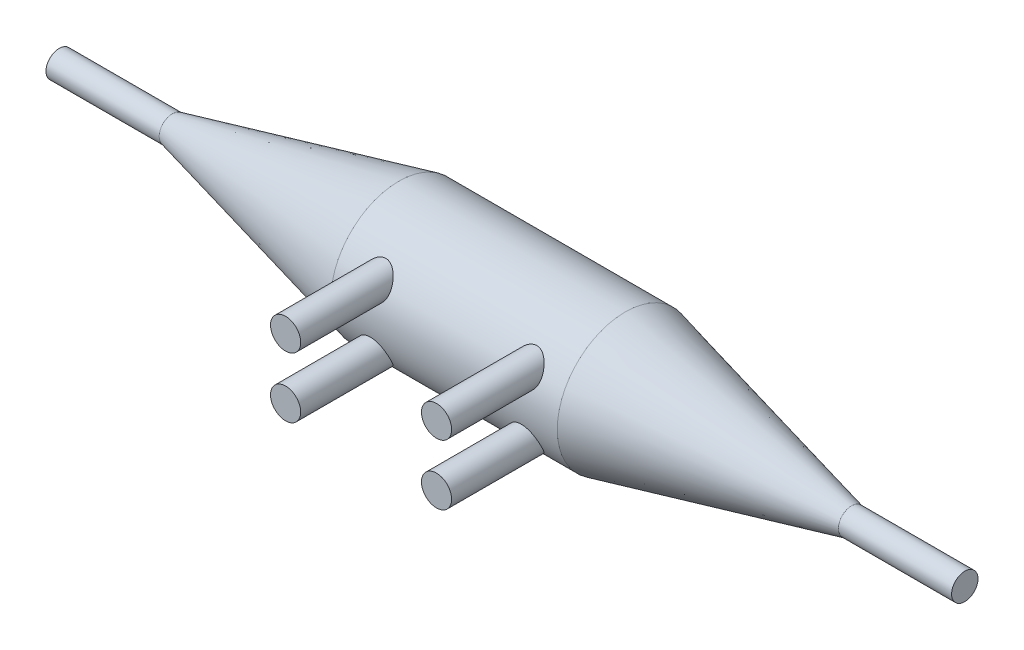
ISO-10303-21;
HEADER;
FILE_DESCRIPTION(('STEP AP214'),'2;1');
FILE_NAME('part.step','',(''),(''),'','','');
FILE_SCHEMA(('AUTOMOTIVE_DESIGN { 1 0 10303 214 1 1 1 1 }'));
ENDSEC;
DATA;
#1=APPLICATION_CONTEXT('core data for automotive mechanical design processes');
#2=APPLICATION_PROTOCOL_DEFINITION('international standard','automotive_design',2000,#1);
#3=PRODUCT_CONTEXT('',#1,'mechanical');
#4=PRODUCT('Part','Part','',(#3));
#5=PRODUCT_RELATED_PRODUCT_CATEGORY('part','',(#4));
#6=PRODUCT_DEFINITION_FORMATION('','',#4);
#7=PRODUCT_DEFINITION_CONTEXT('part definition',#1,'design');
#8=PRODUCT_DEFINITION('design','',#6,#7);
#9=PRODUCT_DEFINITION_SHAPE('','',#8);
#10=(LENGTH_UNIT() NAMED_UNIT(*) SI_UNIT(.MILLI.,.METRE.));
#11=(NAMED_UNIT(*) PLANE_ANGLE_UNIT() SI_UNIT($,.RADIAN.));
#12=(NAMED_UNIT(*) SI_UNIT($,.STERADIAN.) SOLID_ANGLE_UNIT());
#13=UNCERTAINTY_MEASURE_WITH_UNIT(LENGTH_MEASURE(1.E-05),#10,'distance_accuracy_value','');
#14=(GEOMETRIC_REPRESENTATION_CONTEXT(3) GLOBAL_UNCERTAINTY_ASSIGNED_CONTEXT((#13)) GLOBAL_UNIT_ASSIGNED_CONTEXT((#10,
#11,#12)) REPRESENTATION_CONTEXT('',''));
#15=CARTESIAN_POINT('',(0.,0.,0.));
#16=DIRECTION('',(0.,0.,1.));
#17=DIRECTION('',(1.,0.,0.));
#18=AXIS2_PLACEMENT_3D('',#15,#16,#17);
#19=CARTESIAN_POINT('',(103.259169382463,0.,0.));
#20=DIRECTION('',(1.,0.,0.));
#21=DIRECTION('',(0.,1.,0.));
#22=AXIS2_PLACEMENT_3D('',#19,#20,#21);
#23=CYLINDRICAL_SURFACE('',#22,9.);
#24=CARTESIAN_POINT('',(51.2591693824631,4.,8.06225774829855));
#25=CARTESIAN_POINT('',(51.2591714976189,4.12894286634209,7.99828035942443));
#26=CARTESIAN_POINT('',(51.2716561331024,4.25636317802113,7.93117108595877));
#27=CARTESIAN_POINT('',(51.3197199877549,4.50453397744185,7.79290857464164));
#28=CARTESIAN_POINT('',(51.3553252244888,4.62527678469449,7.72175086349652));
#29=CARTESIAN_POINT('',(51.4477930596246,4.85699742894244,7.57813396711227));
#30=CARTESIAN_POINT('',(51.5046033625781,4.9679984658663,7.50567839770059));
#31=CARTESIAN_POINT('',(51.6382866022753,5.17824136437868,7.36220031286894));
#32=CARTESIAN_POINT('',(51.7151531335041,5.27748696570533,7.29117734769488));
#33=CARTESIAN_POINT('',(51.8758580532883,5.44851310528984,7.16403562594676));
#34=CARTESIAN_POINT('',(51.9571375160229,5.52219197700485,7.10723607487638));
#35=CARTESIAN_POINT('',(52.1335477857292,5.65688001901287,7.00050468601119));
#36=CARTESIAN_POINT('',(52.2286586521216,5.71790712707401,6.95056315927193));
#37=CARTESIAN_POINT('',(52.4096514297126,5.81283201869438,6.87124103534052));
#38=CARTESIAN_POINT('',(52.4930199570994,5.8497438259351,6.83975177537048));
#39=CARTESIAN_POINT('',(52.6665861314915,5.91241586631127,6.78565094760878));
#40=CARTESIAN_POINT('',(52.7567776843755,5.93818591592912,6.76303156662231));
#41=CARTESIAN_POINT('',(52.9426795345743,5.97709611066787,6.72867160916216));
#42=CARTESIAN_POINT('',(53.038427047456,5.9901372608548,6.71701632740416));
#43=CARTESIAN_POINT('',(53.2314938270431,6.00214135784505,6.70629375313918));
#44=CARTESIAN_POINT('',(53.3288122132202,6.00111193549046,6.70721963753282));
#45=CARTESIAN_POINT('',(53.5096647599325,5.98607267638007,6.72063993539284));
#46=CARTESIAN_POINT('',(53.5934463000822,5.97364265482083,6.73172624829217));
#47=CARTESIAN_POINT('',(53.7572436070403,5.9387979617287,6.76248579107337));
#48=CARTESIAN_POINT('',(53.8372584597572,5.91638088022875,6.78216109353229));
#49=CARTESIAN_POINT('',(53.9959460978089,5.86133612637421,6.82979630285679));
#50=CARTESIAN_POINT('',(54.0743458140676,5.82824894695553,6.85812523054904));
#51=CARTESIAN_POINT('',(54.224420522914,5.75366083402506,6.92082123981717));
#52=CARTESIAN_POINT('',(54.2960902710201,5.71215341715548,6.95519297145433));
#53=CARTESIAN_POINT('',(54.4659996679798,5.59952552075418,7.04647541229048));
#54=CARTESIAN_POINT('',(54.5598192136922,5.52391986035748,7.10611804947971));
#55=CARTESIAN_POINT('',(54.7308194381208,5.35954219989075,7.23090582968093));
#56=CARTESIAN_POINT('',(54.807973174702,5.27074926636729,7.29605964902877));
#57=CARTESIAN_POINT('',(54.9459064370894,5.08111744991,7.42938965369951));
#58=CARTESIAN_POINT('',(55.0064789752838,4.9801471354169,7.49759267611869));
#59=CARTESIAN_POINT('',(55.1091384320329,4.76902020080053,7.63362460007947));
#60=CARTESIAN_POINT('',(55.1512281289203,4.65886496431493,7.70145355633586));
#61=CARTESIAN_POINT('',(55.2189672178032,4.41971970238255,7.84137353680838));
#62=CARTESIAN_POINT('',(55.2424941703724,4.28995570157253,7.91319067660219));
#63=CARTESIAN_POINT('',(55.2634050975815,4.02526050938796,8.05105623263004));
#64=CARTESIAN_POINT('',(55.2607940115788,3.89033029908306,8.11710573640619));
#65=CARTESIAN_POINT('',(55.2286393274979,3.62956745613372,8.23683086029777));
#66=CARTESIAN_POINT('',(55.2009835084252,3.50375547837379,8.2910478214332));
#67=CARTESIAN_POINT('',(55.120522554561,3.256922690931,8.39107526808628));
#68=CARTESIAN_POINT('',(55.0677419246999,3.13589733702468,8.43689388456359));
#69=CARTESIAN_POINT('',(54.9453721211585,2.91813526407126,8.51447437291231));
#70=CARTESIAN_POINT('',(54.8785201147511,2.82022044132328,8.547259029167));
#71=CARTESIAN_POINT('',(54.7272409266857,2.63658792078014,8.60567781952309));
#72=CARTESIAN_POINT('',(54.642821721995,2.55086471661709,8.63131518676744));
#73=CARTESIAN_POINT('',(54.4659385481601,2.40121829894836,8.67408590301764));
#74=CARTESIAN_POINT('',(54.3745747317556,2.3361329426058,8.69171772859772));
#75=CARTESIAN_POINT('',(54.1815926991063,2.22188298842515,8.72162459247043));
#76=CARTESIAN_POINT('',(54.0799762920694,2.17271558807146,8.73390057384552));
#77=CARTESIAN_POINT('',(53.8722567725792,2.0931238107584,8.75331232187594));
#78=CARTESIAN_POINT('',(53.7663388944744,2.06224553905479,8.76057338362394));
#79=CARTESIAN_POINT('',(53.5506698031292,2.01829960870119,8.77080281204677));
#80=CARTESIAN_POINT('',(53.4409187223279,2.00523133532975,8.77377132688132));
#81=CARTESIAN_POINT('',(53.2212285486072,1.99735458192708,8.7755678621542));
#82=CARTESIAN_POINT('',(53.1112925396853,2.00246395884202,8.77441450881164));
#83=CARTESIAN_POINT('',(52.8938620936641,2.0305923754213,8.76794726549787));
#84=CARTESIAN_POINT('',(52.786367620267,2.05361114865106,8.76263343742122));
#85=CARTESIAN_POINT('',(52.5768899528712,2.11679521220173,8.74758388814477));
#86=CARTESIAN_POINT('',(52.4749057549833,2.1569573673096,8.73784897546021));
#87=CARTESIAN_POINT('',(52.279306336698,2.25307646560481,8.71355789090752));
#88=CARTESIAN_POINT('',(52.18569075506,2.30903272658809,8.69900192727317));
#89=CARTESIAN_POINT('',(52.0092079799698,2.43495337971593,8.66459780827522));
#90=CARTESIAN_POINT('',(51.92636367973,2.50494682935801,8.6447386463461));
#91=CARTESIAN_POINT('',(51.7737804581775,2.65643043337969,8.59939614696698));
#92=CARTESIAN_POINT('',(51.7040418127922,2.73792082975374,8.57391269112718));
#93=CARTESIAN_POINT('',(51.5782486541744,2.91091052214103,8.51674867028052));
#94=CARTESIAN_POINT('',(51.5224171755117,3.00254261226738,8.48498016654166));
#95=CARTESIAN_POINT('',(51.4267064699945,3.19171559160703,8.41564601450613));
#96=CARTESIAN_POINT('',(51.3868282743357,3.2892568623116,8.37807999168418));
#97=CARTESIAN_POINT('',(51.3226792121092,3.48893821901559,8.29693347822423));
#98=CARTESIAN_POINT('',(51.2986754023116,3.59112752152575,8.25326434922474));
#99=CARTESIAN_POINT('',(51.2669155663079,3.79585953040615,8.1611324512423));
#100=CARTESIAN_POINT('',(51.259167715874,3.89840238863849,8.11266728296417));
#101=CARTESIAN_POINT('',(51.2591693824631,4.,8.06225774829855));
#102=B_SPLINE_CURVE_WITH_KNOTS('',3,(#24,#25,#26,#27,#28,#29,#30,#31,#32,#33,#34,#35,#36,#37,
#38,#39,#40,#41,#42,#43,#44,#45,#46,#47,#48,#49,#50,#51,#52,#53,#54,#55,#56,#57,#58,#59,#60,#61,
#62,#63,#64,#65,#66,#67,#68,#69,#70,#71,#72,#73,#74,#75,#76,#77,#78,#79,#80,#81,#82,#83,#84,#85,
#86,#87,#88,#89,#90,#91,#92,#93,#94,#95,#96,#97,#98,#99,#100,#101),.UNSPECIFIED.,.T.,.F.,(4,2,2,
2,2,2,2,2,2,2,2,2,2,2,2,2,2,2,2,2,2,2,2,2,2,2,2,2,2,2,2,2,2,2,2,2,2,2,4),(0.,0.431384036925387,
0.863254352620985,1.2940665620274,1.72474134761834,2.0939769239863,2.46268535999729,
2.75095537535829,3.03897088932177,3.32920891511335,3.61928954342717,3.87439949676252,
4.12957104378785,4.39766220665999,4.66596058144567,5.06713507760778,5.46895334212841,
5.87557990813476,6.2821453292704,6.73030426501388,7.17837851286693,7.59525649002186,
8.01172870490682,8.3787893707191,8.74568372278502,9.08467398018691,9.42360452246104,
9.75372677989927,10.0838376427057,10.412458664781,10.741074798119,11.0696308592683,
11.3981727310745,11.7274018499288,12.0566378996242,12.3908559014187,12.7250955030616,
13.0648239632767,13.4047232456055),.UNSPECIFIED.);
#103=CARTESIAN_POINT('',(51.2591693824631,4.,8.06225774829855));
#104=VERTEX_POINT('',#103);
#105=EDGE_CURVE('E113',#104,#104,#102,.T.);
#106=ORIENTED_EDGE('',*,*,#105,.T.);
#107=EDGE_LOOP('',(#106));
#108=FACE_BOUND('',#107,.T.);
#109=CARTESIAN_POINT('',(31.2591693824631,4.,8.06225774829855));
#110=CARTESIAN_POINT('',(31.2591714976189,4.12894286634209,7.99828035942443));
#111=CARTESIAN_POINT('',(31.2716561331024,4.25636317802113,7.93117108595877));
#112=CARTESIAN_POINT('',(31.3197199877549,4.50453397744185,7.79290857464164));
#113=CARTESIAN_POINT('',(31.3553252244888,4.62527678469449,7.72175086349652));
#114=CARTESIAN_POINT('',(31.4477930596246,4.85699742894244,7.57813396711227));
#115=CARTESIAN_POINT('',(31.5046033625781,4.9679984658663,7.50567839770059));
#116=CARTESIAN_POINT('',(31.6382866022753,5.17824136437869,7.36220031286893));
#117=CARTESIAN_POINT('',(31.7151531335041,5.27748696570533,7.29117734769488));
#118=CARTESIAN_POINT('',(31.8758580532883,5.44851310528984,7.16403562594676));
#119=CARTESIAN_POINT('',(31.9571375160229,5.52219197700485,7.10723607487638));
#120=CARTESIAN_POINT('',(32.1335477857292,5.65688001901287,7.00050468601118));
#121=CARTESIAN_POINT('',(32.2286586521216,5.71790712707401,6.95056315927193));
#122=CARTESIAN_POINT('',(32.4096514297126,5.81283201869438,6.87124103534052));
#123=CARTESIAN_POINT('',(32.4930199570994,5.8497438259351,6.83975177537048));
#124=CARTESIAN_POINT('',(32.6665861314915,5.91241586631126,6.78565094760878));
#125=CARTESIAN_POINT('',(32.7567776843755,5.93818591592912,6.76303156662231));
#126=CARTESIAN_POINT('',(32.9426795345743,5.97709611066787,6.72867160916215));
#127=CARTESIAN_POINT('',(33.038427047456,5.9901372608548,6.71701632740416));
#128=CARTESIAN_POINT('',(33.2314938270431,6.00214135784505,6.70629375313918));
#129=CARTESIAN_POINT('',(33.3288122132202,6.00111193549046,6.70721963753281));
#130=CARTESIAN_POINT('',(33.5096647599325,5.98607267638008,6.72063993539284));
#131=CARTESIAN_POINT('',(33.5934463000822,5.97364265482083,6.73172624829217));
#132=CARTESIAN_POINT('',(33.7572436070403,5.9387979617287,6.76248579107336));
#133=CARTESIAN_POINT('',(33.8372584597572,5.91638088022875,6.78216109353228));
#134=CARTESIAN_POINT('',(33.9959460978088,5.86133612637421,6.82979630285679));
#135=CARTESIAN_POINT('',(34.0743458140676,5.82824894695553,6.85812523054904));
#136=CARTESIAN_POINT('',(34.224420522914,5.75366083402506,6.92082123981717));
#137=CARTESIAN_POINT('',(34.2960902710201,5.71215341715548,6.95519297145433));
#138=CARTESIAN_POINT('',(34.4659996679798,5.59952552075418,7.04647541229048));
#139=CARTESIAN_POINT('',(34.5598192136922,5.52391986035749,7.10611804947971));
#140=CARTESIAN_POINT('',(34.7308194381208,5.35954219989075,7.23090582968093));
#141=CARTESIAN_POINT('',(34.807973174702,5.2707492663673,7.29605964902877));
#142=CARTESIAN_POINT('',(34.9459064370894,5.08111744991,7.4293896536995));
#143=CARTESIAN_POINT('',(35.0064789752838,4.98014713541691,7.49759267611868));
#144=CARTESIAN_POINT('',(35.1091384320329,4.76902020080054,7.63362460007946));
#145=CARTESIAN_POINT('',(35.1512281289203,4.65886496431493,7.70145355633586));
#146=CARTESIAN_POINT('',(35.2189672178032,4.41971970238256,7.84137353680838));
#147=CARTESIAN_POINT('',(35.2424941703724,4.28995570157254,7.91319067660218));
#148=CARTESIAN_POINT('',(35.2634050975815,4.02526050938797,8.05105623263003));
#149=CARTESIAN_POINT('',(35.2607940115788,3.89033029908307,8.11710573640618));
#150=CARTESIAN_POINT('',(35.2286393274979,3.62956745613373,8.23683086029776));
#151=CARTESIAN_POINT('',(35.2009835084253,3.5037554783738,8.2910478214332));
#152=CARTESIAN_POINT('',(35.120522554561,3.25692269093101,8.39107526808627));
#153=CARTESIAN_POINT('',(35.0677419246999,3.1358973370247,8.43689388456359));
#154=CARTESIAN_POINT('',(34.9453721211585,2.91813526407127,8.51447437291231));
#155=CARTESIAN_POINT('',(34.8785201147511,2.82022044132329,8.547259029167));
#156=CARTESIAN_POINT('',(34.7272409266857,2.63658792078015,8.60567781952309));
#157=CARTESIAN_POINT('',(34.642821721995,2.55086471661709,8.63131518676743));
#158=CARTESIAN_POINT('',(34.4659385481601,2.40121829894836,8.67408590301764));
#159=CARTESIAN_POINT('',(34.3745747317556,2.3361329426058,8.69171772859772));
#160=CARTESIAN_POINT('',(34.1815926991063,2.22188298842516,8.72162459247042));
#161=CARTESIAN_POINT('',(34.0799762920694,2.17271558807147,8.73390057384551));
#162=CARTESIAN_POINT('',(33.8722567725793,2.09312381075841,8.75331232187594));
#163=CARTESIAN_POINT('',(33.7663388944744,2.06224553905479,8.76057338362394));
#164=CARTESIAN_POINT('',(33.5506698031292,2.01829960870119,8.77080281204677));
#165=CARTESIAN_POINT('',(33.4409187223279,2.00523133532975,8.77377132688133));
#166=CARTESIAN_POINT('',(33.2212285486072,1.99735458192708,8.7755678621542));
#167=CARTESIAN_POINT('',(33.1112925396853,2.00246395884202,8.77441450881163));
#168=CARTESIAN_POINT('',(32.8938620936641,2.0305923754213,8.76794726549786));
#169=CARTESIAN_POINT('',(32.786367620267,2.05361114865106,8.76263343742122));
#170=CARTESIAN_POINT('',(32.5768899528712,2.11679521220173,8.74758388814477));
#171=CARTESIAN_POINT('',(32.4749057549833,2.1569573673096,8.73784897546021));
#172=CARTESIAN_POINT('',(32.279306336698,2.25307646560481,8.71355789090753));
#173=CARTESIAN_POINT('',(32.18569075506,2.30903272658809,8.69900192727317));
#174=CARTESIAN_POINT('',(32.0092079799698,2.43495337971592,8.66459780827522));
#175=CARTESIAN_POINT('',(31.9263636797301,2.50494682935801,8.6447386463461));
#176=CARTESIAN_POINT('',(31.7737804581775,2.65643043337969,8.59939614696698));
#177=CARTESIAN_POINT('',(31.7040418127922,2.73792082975373,8.57391269112718));
#178=CARTESIAN_POINT('',(31.5782486541744,2.91091052214103,8.51674867028052));
#179=CARTESIAN_POINT('',(31.5224171755117,3.00254261226738,8.48498016654166));
#180=CARTESIAN_POINT('',(31.4267064699945,3.19171559160702,8.41564601450614));
#181=CARTESIAN_POINT('',(31.3868282743357,3.28925686231159,8.37807999168418));
#182=CARTESIAN_POINT('',(31.3226792121092,3.48893821901558,8.29693347822424));
#183=CARTESIAN_POINT('',(31.2986754023116,3.59112752152575,8.25326434922474));
#184=CARTESIAN_POINT('',(31.2669155663079,3.79585953040615,8.1611324512423));
#185=CARTESIAN_POINT('',(31.259167715874,3.89840238863849,8.11266728296417));
#186=CARTESIAN_POINT('',(31.2591693824631,4.,8.06225774829855));
#187=B_SPLINE_CURVE_WITH_KNOTS('',3,(#109,#110,#111,#112,#113,#114,#115,#116,#117,#118,#119,
#120,#121,#122,#123,#124,#125,#126,#127,#128,#129,#130,#131,#132,#133,#134,#135,#136,#137,#138,
#139,#140,#141,#142,#143,#144,#145,#146,#147,#148,#149,#150,#151,#152,#153,#154,#155,#156,#157,
#158,#159,#160,#161,#162,#163,#164,#165,#166,#167,#168,#169,#170,#171,#172,#173,#174,#175,#176,
#177,#178,#179,#180,#181,#182,#183,#184,#185,#186),.UNSPECIFIED.,.T.,.F.,(4,2,2,2,2,2,2,2,2,2,2,
2,2,2,2,2,2,2,2,2,2,2,2,2,2,2,2,2,2,2,2,2,2,2,2,2,2,2,4),(0.,0.431384036925385,
0.863254352620985,1.2940665620274,1.72474134761834,2.0939769239863,2.46268535999729,
2.75095537535827,3.03897088932176,3.32920891511335,3.61928954342716,3.87439949676251,
4.12957104378784,4.39766220665999,4.66596058144567,5.06713507760778,5.4689533421284,
5.87557990813475,6.2821453292704,6.73030426501388,7.17837851286692,7.59525649002185,
8.01172870490681,8.3787893707191,8.74568372278502,9.08467398018691,9.42360452246103,
9.75372677989926,10.0838376427057,10.412458664781,10.741074798119,11.0696308592683,
11.3981727310745,11.7274018499288,12.0566378996242,12.3908559014187,12.7250955030616,
13.0648239632767,13.4047232456056),.UNSPECIFIED.);
#188=CARTESIAN_POINT('',(31.2591693824631,4.,8.06225774829855));
#189=VERTEX_POINT('',#188);
#190=EDGE_CURVE('E61',#189,#189,#187,.T.);
#191=ORIENTED_EDGE('',*,*,#190,.T.);
#192=EDGE_LOOP('',(#191));
#193=FACE_BOUND('',#192,.T.);
#194=CARTESIAN_POINT('',(28.2591693824631,0.,0.));
#195=DIRECTION('',(1.,0.,0.));
#196=DIRECTION('',(0.,1.,0.));
#197=AXIS2_PLACEMENT_3D('',#194,#195,#196);
#198=CIRCLE('',#197,9.);
#199=CARTESIAN_POINT('',(28.2591693824631,9.,0.));
#200=VERTEX_POINT('',#199);
#201=EDGE_CURVE('E57',#200,#200,#198,.T.);
#202=ORIENTED_EDGE('',*,*,#201,.T.);
#203=EDGE_LOOP('',(#202));
#204=FACE_BOUND('',#203,.T.);
#205=CARTESIAN_POINT('',(58.2591693824631,0.,0.));
#206=DIRECTION('',(1.,0.,0.));
#207=DIRECTION('',(0.,1.,0.));
#208=AXIS2_PLACEMENT_3D('',#205,#206,#207);
#209=CIRCLE('',#208,8.99999999999999);
#210=CARTESIAN_POINT('',(58.2591693824631,-9.,0.));
#211=VERTEX_POINT('',#210);
#212=EDGE_CURVE('E121',#211,#211,#209,.T.);
#213=ORIENTED_EDGE('',*,*,#212,.F.);
#214=EDGE_LOOP('',(#213));
#215=FACE_BOUND('',#214,.T.);
#216=CARTESIAN_POINT('',(31.2591693824631,-4.,8.06225774829855));
#217=CARTESIAN_POINT('',(31.2591729859442,-3.88819498255086,8.1177251933736));
#218=CARTESIAN_POINT('',(31.2685685907921,-3.77508517782306,8.17092075009496));
#219=CARTESIAN_POINT('',(31.30721541854,-3.54944309654731,8.271441782327));
#220=CARTESIAN_POINT('',(31.3364967383582,-3.436911956295,8.31875823124603));
#221=CARTESIAN_POINT('',(31.4155272172496,-3.21591588631706,8.40666797562641));
#222=CARTESIAN_POINT('',(31.4653464534785,-3.1074662794177,8.44723757854512));
#223=CARTESIAN_POINT('',(31.5849277564581,-2.89941348659935,8.52089123641491));
#224=CARTESIAN_POINT('',(31.6546760492535,-2.79980425276624,8.55398043324871));
#225=CARTESIAN_POINT('',(31.8066973583322,-2.62045938949496,8.61054074377932));
#226=CARTESIAN_POINT('',(31.8876950670757,-2.53980633880364,8.63453538190431));
#227=CARTESIAN_POINT('',(32.0632130519027,-2.3928984550645,8.67639825696416));
#228=CARTESIAN_POINT('',(32.1577309090597,-2.32664105178206,8.69426758785626));
#229=CARTESIAN_POINT('',(32.3529015860046,-2.21371417940272,8.72368809535035));
#230=CARTESIAN_POINT('',(32.4530840575554,-2.16629475393257,8.73548832687957));
#231=CARTESIAN_POINT('',(32.660292601347,-2.08856419647635,8.75439947513368));
#232=CARTESIAN_POINT('',(32.7673180130088,-2.05825141587858,8.76151084374755));
#233=CARTESIAN_POINT('',(32.9838498777503,-2.01600656535591,8.77132754200848));
#234=CARTESIAN_POINT('',(33.09331384833,-2.00386785521056,8.77408242570912));
#235=CARTESIAN_POINT('',(33.3127770044608,-1.99770740418875,8.77548724023928));
#236=CARTESIAN_POINT('',(33.4227761830643,-2.0036854287615,8.77413722421343));
#237=CARTESIAN_POINT('',(33.6400485693978,-2.03354596502221,8.76726416460685));
#238=CARTESIAN_POINT('',(33.7473248748113,-2.05740709246258,8.76174610502532));
#239=CARTESIAN_POINT('',(33.956242202485,-2.12222200308059,8.74627207643438));
#240=CARTESIAN_POINT('',(34.0578833814932,-2.16317531054808,8.73631623093705));
#241=CARTESIAN_POINT('',(34.2527181767486,-2.26082216125914,8.71155602780752));
#242=CARTESIAN_POINT('',(34.3459076678058,-2.31752333662496,8.69674931860299));
#243=CARTESIAN_POINT('',(34.5212248308717,-2.44470459043707,8.66185618974944));
#244=CARTESIAN_POINT('',(34.6033528953683,-2.51518417977226,8.6417699575061));
#245=CARTESIAN_POINT('',(34.7549712686839,-2.66799430440357,8.59582444728445));
#246=CARTESIAN_POINT('',(34.8243727830543,-2.75040142221722,8.5699272174494));
#247=CARTESIAN_POINT('',(34.9483379776932,-2.9238593588684,8.51230813394993));
#248=CARTESIAN_POINT('',(35.0029005275275,-3.01491083552192,8.48058583683932));
#249=CARTESIAN_POINT('',(35.0977710474321,-3.20551011891368,8.41042867822864));
#250=CARTESIAN_POINT('',(35.1376022443884,-3.30523087431733,8.37182098179082));
#251=CARTESIAN_POINT('',(35.2005036866402,-3.50759651586802,8.28907284054096));
#252=CARTESIAN_POINT('',(35.2235689877717,-3.6102422553096,8.24493076816991));
#253=CARTESIAN_POINT('',(35.2544397500707,-3.82312754935518,8.14851541370557));
#254=CARTESIAN_POINT('',(35.2610247616973,-3.93338090229953,8.09588531033252));
#255=CARTESIAN_POINT('',(35.2564171415442,-4.15131916891198,7.98632923797798));
#256=CARTESIAN_POINT('',(35.2452183844585,-4.25900318464907,7.92940179528666));
#257=CARTESIAN_POINT('',(35.2040631242515,-4.48114951889358,7.80622338609317));
#258=CARTESIAN_POINT('',(35.1721929589909,-4.59506910691463,7.73963291253862));
#259=CARTESIAN_POINT('',(35.0894159397671,-4.81487016251242,7.60484632327977));
#260=CARTESIAN_POINT('',(35.0384888443836,-4.92074293875491,7.5366485728255));
#261=CARTESIAN_POINT('',(34.9129966020151,-5.13196979534893,7.39463053360368));
#262=CARTESIAN_POINT('',(34.8366492326262,-5.23632466438319,7.32088961184441));
#263=CARTESIAN_POINT('',(34.663267978129,-5.43016929205724,7.17827956260325));
#264=CARTESIAN_POINT('',(34.5662555356668,-5.51967428938179,7.109405483056));
#265=CARTESIAN_POINT('',(34.381688038508,-5.65811904566684,6.99937541279924));
#266=CARTESIAN_POINT('',(34.2988579354835,-5.71144756303144,6.95580304501224));
#267=CARTESIAN_POINT('',(34.1232736680207,-5.80644568979588,6.87669980283816));
#268=CARTESIAN_POINT('',(34.0305362741252,-5.84813458297591,6.84115564672018));
#269=CARTESIAN_POINT('',(33.8529696581547,-5.91173518548808,6.78622550888167));
#270=CARTESIAN_POINT('',(33.7694480800287,-5.93579745661685,6.76512477843833));
#271=CARTESIAN_POINT('',(33.5982145511026,-5.97299378830131,6.73230798201386));
#272=CARTESIAN_POINT('',(33.5105056727272,-5.98613573516691,6.72058514384654));
#273=CARTESIAN_POINT('',(33.3329986035714,-6.00062579069745,6.70765182843851));
#274=CARTESIAN_POINT('',(33.2431939277761,-6.00193045064401,6.7064800790493));
#275=CARTESIAN_POINT('',(33.0647295137664,-5.99253138952387,6.71487920991739));
#276=CARTESIAN_POINT('',(32.976069934178,-5.98182602242163,6.72445156270887));
#277=CARTESIAN_POINT('',(32.8072448962726,-5.95006425123586,6.75256582382559));
#278=CARTESIAN_POINT('',(32.7268791991748,-5.92959708175384,6.77059627879864));
#279=CARTESIAN_POINT('',(32.5710815493275,-5.87969123902813,6.81397987778613));
#280=CARTESIAN_POINT('',(32.4956527121973,-5.85024696545914,6.83933759236056));
#281=CARTESIAN_POINT('',(32.3214516484762,-5.77008904778911,6.90722879110725));
#282=CARTESIAN_POINT('',(32.2255132010573,-5.71558526173381,6.95256658591336));
#283=CARTESIAN_POINT('',(32.0463353817258,-5.59398902651008,7.05077335272773));
#284=CARTESIAN_POINT('',(31.963115059403,-5.52687802261082,7.10365339710181));
#285=CARTESIAN_POINT('',(31.8085984866595,-5.38105123056526,7.21476416384233));
#286=CARTESIAN_POINT('',(31.7375147629874,-5.30216666295077,7.27306706934972));
#287=CARTESIAN_POINT('',(31.6092398167879,-5.13526103107292,7.3918605880246));
#288=CARTESIAN_POINT('',(31.5520559363453,-5.04723517313959,7.45235233807305));
#289=CARTESIAN_POINT('',(31.4419583414773,-4.84474562279859,7.58590585844797));
#290=CARTESIAN_POINT('',(31.3922790530782,-4.72854627184658,7.65902169439187));
#291=CARTESIAN_POINT('',(31.3154246085587,-4.48761997835233,7.80261728677751));
#292=CARTESIAN_POINT('',(31.2881992615288,-4.36291273321512,7.87310258437513));
#293=CARTESIAN_POINT('',(31.2684872785497,-4.19676513471165,7.96172849226289));
#294=CARTESIAN_POINT('',(31.2650078080679,-4.15769235533062,7.98220181716868));
#295=CARTESIAN_POINT('',(31.2603479798012,-4.07913447120782,8.02263132252688));
#296=CARTESIAN_POINT('',(31.2591681045648,-4.0396492816729,8.04258739357179));
#297=CARTESIAN_POINT('',(31.2591693824631,-4.,8.06225774829855));
#298=B_SPLINE_CURVE_WITH_KNOTS('',3,(#216,#217,#218,#219,#220,#221,#222,#223,#224,#225,#226,
#227,#228,#229,#230,#231,#232,#233,#234,#235,#236,#237,#238,#239,#240,#241,#242,#243,#244,#245,
#246,#247,#248,#249,#250,#251,#252,#253,#254,#255,#256,#257,#258,#259,#260,#261,#262,#263,#264,
#265,#266,#267,#268,#269,#270,#271,#272,#273,#274,#275,#276,#277,#278,#279,#280,#281,#282,#283,
#284,#285,#286,#287,#288,#289,#290,#291,#292,#293,#294,#295,#296,#297),.UNSPECIFIED.,.T.,.F.,(4,
2,2,2,2,2,2,2,2,2,2,2,2,2,2,2,2,2,2,2,2,2,2,2,2,2,2,2,2,2,2,2,2,2,2,2,2,2,2,2,4),(0.,
0.374267942088711,0.749103602732428,1.1252289623851,1.50109498944482,1.84969992810314,
2.19824257473012,2.53103241953376,2.86379018703846,3.19273495876871,3.52167547178866,
3.8502232708187,4.17876192630471,4.50746008502505,4.83614657761784,5.16704566925021,
5.49796996176234,5.83882253859479,6.17977559011071,6.54531708352482,6.91098450858127,
7.3165572042518,7.72256190956059,8.16702738151459,8.6110338910956,8.93304823364123,
9.25452587434948,9.52173622115512,9.78875342904813,10.056750327903,10.3247839615893,
10.5783656349548,10.83210582891,11.1880412522694,11.5445046886308,11.9066822218362,
12.269050648395,12.7051259700326,13.1402238777285,13.2729222347804,13.4056484343337),.UNSPECIFIED.);
#299=CARTESIAN_POINT('',(31.2591693824631,-4.,8.06225774829855));
#300=VERTEX_POINT('',#299);
#301=EDGE_CURVE('E71',#300,#300,#298,.T.);
#302=ORIENTED_EDGE('',*,*,#301,.T.);
#303=EDGE_LOOP('',(#302));
#304=FACE_BOUND('',#303,.T.);
#305=CARTESIAN_POINT('',(51.2591693824631,-4.,8.06225774829855));
#306=CARTESIAN_POINT('',(51.2591729859442,-3.88819498255086,8.1177251933736));
#307=CARTESIAN_POINT('',(51.2685685907921,-3.77508517782306,8.17092075009496));
#308=CARTESIAN_POINT('',(51.30721541854,-3.54944309654731,8.271441782327));
#309=CARTESIAN_POINT('',(51.3364967383582,-3.436911956295,8.31875823124603));
#310=CARTESIAN_POINT('',(51.4155272172496,-3.21591588631706,8.40666797562641));
#311=CARTESIAN_POINT('',(51.4653464534785,-3.1074662794177,8.44723757854512));
#312=CARTESIAN_POINT('',(51.5849277564581,-2.89941348659935,8.52089123641491));
#313=CARTESIAN_POINT('',(51.6546760492535,-2.79980425276624,8.55398043324871));
#314=CARTESIAN_POINT('',(51.8066973583322,-2.62045938949496,8.61054074377932));
#315=CARTESIAN_POINT('',(51.8876950670757,-2.53980633880364,8.63453538190431));
#316=CARTESIAN_POINT('',(52.0632130519027,-2.3928984550645,8.67639825696416));
#317=CARTESIAN_POINT('',(52.1577309090597,-2.32664105178206,8.69426758785626));
#318=CARTESIAN_POINT('',(52.3529015860046,-2.21371417940272,8.72368809535035));
#319=CARTESIAN_POINT('',(52.4530840575554,-2.16629475393257,8.73548832687957));
#320=CARTESIAN_POINT('',(52.660292601347,-2.08856419647635,8.75439947513368));
#321=CARTESIAN_POINT('',(52.7673180130088,-2.05825141587858,8.76151084374755));
#322=CARTESIAN_POINT('',(52.9838498777503,-2.01600656535591,8.77132754200847));
#323=CARTESIAN_POINT('',(53.09331384833,-2.00386785521056,8.77408242570912));
#324=CARTESIAN_POINT('',(53.3127770044608,-1.99770740418875,8.77548724023928));
#325=CARTESIAN_POINT('',(53.4227761830643,-2.0036854287615,8.77413722421343));
#326=CARTESIAN_POINT('',(53.6400485693977,-2.03354596502221,8.76726416460685));
#327=CARTESIAN_POINT('',(53.7473248748113,-2.05740709246258,8.76174610502532));
#328=CARTESIAN_POINT('',(53.956242202485,-2.12222200308059,8.74627207643438));
#329=CARTESIAN_POINT('',(54.0578833814931,-2.16317531054808,8.73631623093705));
#330=CARTESIAN_POINT('',(54.2527181767486,-2.26082216125914,8.71155602780752));
#331=CARTESIAN_POINT('',(54.3459076678058,-2.31752333662495,8.69674931860299));
#332=CARTESIAN_POINT('',(54.5212248308717,-2.44470459043707,8.66185618974943));
#333=CARTESIAN_POINT('',(54.6033528953683,-2.51518417977226,8.6417699575061));
#334=CARTESIAN_POINT('',(54.7549712686839,-2.66799430440357,8.59582444728445));
#335=CARTESIAN_POINT('',(54.8243727830543,-2.75040142221722,8.5699272174494));
#336=CARTESIAN_POINT('',(54.9483379776932,-2.9238593588684,8.51230813394993));
#337=CARTESIAN_POINT('',(55.0029005275275,-3.01491083552192,8.48058583683932));
#338=CARTESIAN_POINT('',(55.0977710474321,-3.20551011891369,8.41042867822864));
#339=CARTESIAN_POINT('',(55.1376022443884,-3.30523087431733,8.37182098179081));
#340=CARTESIAN_POINT('',(55.2005036866402,-3.50759651586802,8.28907284054095));
#341=CARTESIAN_POINT('',(55.2235689877717,-3.6102422553096,8.24493076816991));
#342=CARTESIAN_POINT('',(55.2544397500707,-3.82312754935518,8.14851541370557));
#343=CARTESIAN_POINT('',(55.2610247616973,-3.93338090229953,8.09588531033252));
#344=CARTESIAN_POINT('',(55.2564171415442,-4.15131916891198,7.98632923797797));
#345=CARTESIAN_POINT('',(55.2452183844585,-4.25900318464907,7.92940179528666));
#346=CARTESIAN_POINT('',(55.2040631242515,-4.48114951889358,7.80622338609317));
#347=CARTESIAN_POINT('',(55.1721929589909,-4.59506910691462,7.73963291253861));
#348=CARTESIAN_POINT('',(55.0894159397671,-4.81487016251242,7.60484632327977));
#349=CARTESIAN_POINT('',(55.0384888443836,-4.92074293875491,7.5366485728255));
#350=CARTESIAN_POINT('',(54.9129966020151,-5.13196979534893,7.39463053360368));
#351=CARTESIAN_POINT('',(54.8366492326262,-5.23632466438319,7.32088961184441));
#352=CARTESIAN_POINT('',(54.663267978129,-5.43016929205723,7.17827956260325));
#353=CARTESIAN_POINT('',(54.5662555356668,-5.51967428938179,7.109405483056));
#354=CARTESIAN_POINT('',(54.381688038508,-5.65811904566684,6.99937541279924));
#355=CARTESIAN_POINT('',(54.2988579354835,-5.71144756303145,6.95580304501223));
#356=CARTESIAN_POINT('',(54.1232736680207,-5.80644568979588,6.87669980283816));
#357=CARTESIAN_POINT('',(54.0305362741252,-5.84813458297591,6.84115564672017));
#358=CARTESIAN_POINT('',(53.8529696581547,-5.91173518548808,6.78622550888167));
#359=CARTESIAN_POINT('',(53.7694480800287,-5.93579745661685,6.76512477843833));
#360=CARTESIAN_POINT('',(53.5982145511026,-5.97299378830131,6.73230798201386));
#361=CARTESIAN_POINT('',(53.5105056727272,-5.98613573516691,6.72058514384654));
#362=CARTESIAN_POINT('',(53.3329986035714,-6.00062579069745,6.70765182843851));
#363=CARTESIAN_POINT('',(53.2431939277761,-6.00193045064401,6.70648007904929));
#364=CARTESIAN_POINT('',(53.0647295137664,-5.99253138952387,6.71487920991739));
#365=CARTESIAN_POINT('',(52.976069934178,-5.98182602242163,6.72445156270887));
#366=CARTESIAN_POINT('',(52.8072448962726,-5.95006425123586,6.75256582382559));
#367=CARTESIAN_POINT('',(52.7268791991747,-5.92959708175384,6.77059627879864));
#368=CARTESIAN_POINT('',(52.5710815493275,-5.87969123902813,6.81397987778613));
#369=CARTESIAN_POINT('',(52.4956527121973,-5.85024696545914,6.83933759236056));
#370=CARTESIAN_POINT('',(52.3214516484762,-5.77008904778911,6.90722879110724));
#371=CARTESIAN_POINT('',(52.2255132010573,-5.71558526173381,6.95256658591336));
#372=CARTESIAN_POINT('',(52.0463353817258,-5.59398902651008,7.05077335272773));
#373=CARTESIAN_POINT('',(51.963115059403,-5.52687802261082,7.10365339710181));
#374=CARTESIAN_POINT('',(51.8085984866595,-5.38105123056526,7.21476416384233));
#375=CARTESIAN_POINT('',(51.7375147629874,-5.30216666295077,7.27306706934972));
#376=CARTESIAN_POINT('',(51.6092398167879,-5.13526103107291,7.3918605880246));
#377=CARTESIAN_POINT('',(51.5520559363453,-5.04723517313959,7.45235233807305));
#378=CARTESIAN_POINT('',(51.4419583414773,-4.8447456227986,7.58590585844797));
#379=CARTESIAN_POINT('',(51.3922790530782,-4.72854627184658,7.65902169439187));
#380=CARTESIAN_POINT('',(51.3154246085588,-4.48761997835233,7.80261728677751));
#381=CARTESIAN_POINT('',(51.2881992615288,-4.36291273321513,7.87310258437513));
#382=CARTESIAN_POINT('',(51.2684872785497,-4.19676513471166,7.96172849226289));
#383=CARTESIAN_POINT('',(51.2650078080679,-4.15769235533063,7.98220181716867));
#384=CARTESIAN_POINT('',(51.2603479798012,-4.07913447120783,8.02263132252688));
#385=CARTESIAN_POINT('',(51.2591681045648,-4.03964928167291,8.04258739357178));
#386=CARTESIAN_POINT('',(51.2591693824631,-4.,8.06225774829855));
#387=B_SPLINE_CURVE_WITH_KNOTS('',3,(#305,#306,#307,#308,#309,#310,#311,#312,#313,#314,#315,
#316,#317,#318,#319,#320,#321,#322,#323,#324,#325,#326,#327,#328,#329,#330,#331,#332,#333,#334,
#335,#336,#337,#338,#339,#340,#341,#342,#343,#344,#345,#346,#347,#348,#349,#350,#351,#352,#353,
#354,#355,#356,#357,#358,#359,#360,#361,#362,#363,#364,#365,#366,#367,#368,#369,#370,#371,#372,
#373,#374,#375,#376,#377,#378,#379,#380,#381,#382,#383,#384,#385,#386),.UNSPECIFIED.,.T.,.F.,(4,
2,2,2,2,2,2,2,2,2,2,2,2,2,2,2,2,2,2,2,2,2,2,2,2,2,2,2,2,2,2,2,2,2,2,2,2,2,2,2,4),(0.,
0.374267942088713,0.749103602732428,1.12522896238511,1.50109498944482,1.84969992810314,
2.19824257473012,2.53103241953376,2.86379018703846,3.19273495876871,3.52167547178865,
3.8502232708187,4.17876192630471,4.50746008502504,4.83614657761785,5.16704566925021,
5.49796996176234,5.83882253859479,6.17977559011071,6.54531708352482,6.91098450858127,
7.3165572042518,7.72256190956059,8.16702738151458,8.6110338910956,8.93304823364124,
9.25452587434948,9.52173622115512,9.78875342904813,10.056750327903,10.3247839615893,
10.5783656349548,10.83210582891,11.1880412522694,11.5445046886308,11.9066822218362,
12.269050648395,12.7051259700326,13.1402238777285,13.2729222347804,13.4056484343337),.UNSPECIFIED.);
#388=CARTESIAN_POINT('',(51.2591693824631,-4.,8.06225774829855));
#389=VERTEX_POINT('',#388);
#390=EDGE_CURVE('E41',#389,#389,#387,.T.);
#391=ORIENTED_EDGE('',*,*,#390,.T.);
#392=EDGE_LOOP('',(#391));
#393=FACE_BOUND('',#392,.T.);
#394=ADVANCED_FACE('F37',(#108,#193,#204,#215,#304,#393),#23,.T.);
#395=CARTESIAN_POINT('',(-16.7408306175369,0.,0.));
#396=DIRECTION('',(-1.,0.,0.));
#397=DIRECTION('',(0.,-1.,0.));
#398=AXIS2_PLACEMENT_3D('',#395,#396,#397);
#399=PLANE('',#398);
#400=CARTESIAN_POINT('',(-16.7408306175369,0.,0.));
#401=DIRECTION('',(1.,0.,0.));
#402=DIRECTION('',(0.,1.,0.));
#403=AXIS2_PLACEMENT_3D('',#400,#401,#402);
#404=CIRCLE('',#403,1.75);
#405=CARTESIAN_POINT('',(-16.7408306175369,1.74999999999999,0.));
#406=VERTEX_POINT('',#405);
#407=EDGE_CURVE('E10',#406,#406,#404,.T.);
#408=ORIENTED_EDGE('',*,*,#407,.F.);
#409=EDGE_LOOP('',(#408));
#410=FACE_BOUND('',#409,.T.);
#411=ADVANCED_FACE('F39',(#410),#399,.T.);
#412=CARTESIAN_POINT('',(103.259169382463,0.,0.));
#413=DIRECTION('',(1.,0.,0.));
#414=DIRECTION('',(0.,1.,0.));
#415=AXIS2_PLACEMENT_3D('',#412,#413,#414);
#416=CYLINDRICAL_SURFACE('',#415,1.75);
#417=ORIENTED_EDGE('',*,*,#407,.T.);
#418=EDGE_LOOP('',(#417));
#419=FACE_BOUND('',#418,.T.);
#420=CARTESIAN_POINT('',(-1.7408306175369,0.,0.));
#421=DIRECTION('',(1.,0.,0.));
#422=DIRECTION('',(0.,1.,0.));
#423=AXIS2_PLACEMENT_3D('',#420,#421,#422);
#424=CIRCLE('',#423,1.75000000000001);
#425=CARTESIAN_POINT('',(-1.7408306175369,1.75,0.));
#426=VERTEX_POINT('',#425);
#427=EDGE_CURVE('E51',#426,#426,#424,.T.);
#428=ORIENTED_EDGE('',*,*,#427,.F.);
#429=EDGE_LOOP('',(#428));
#430=FACE_BOUND('',#429,.T.);
#431=ADVANCED_FACE('F100',(#419,#430),#416,.T.);
#432=CARTESIAN_POINT('',(28.2591693824631,0.,0.));
#433=DIRECTION('',(1.,0.,0.));
#434=DIRECTION('',(0.,1.,0.));
#435=AXIS2_PLACEMENT_3D('',#432,#433,#434);
#436=CONICAL_SURFACE('',#435,9.,0.237120278724663);
#437=CARTESIAN_POINT('',(-1.7408306175369,1.75,0.));
#438=CARTESIAN_POINT('',(-1.4283306175369,1.82552083333333,0.));
#439=CARTESIAN_POINT('',(-1.11583061753689,1.90104166666667,0.));
#440=CARTESIAN_POINT('',(-0.490830617536895,2.05208333333333,0.));
#441=CARTESIAN_POINT('',(-0.178330617536896,2.12760416666667,0.));
#442=CARTESIAN_POINT('',(0.446669382463103,2.27864583333333,0.));
#443=CARTESIAN_POINT('',(0.759169382463103,2.35416666666667,0.));
#444=CARTESIAN_POINT('',(1.3841693824631,2.50520833333333,0.));
#445=CARTESIAN_POINT('',(1.6966693824631,2.58072916666667,0.));
#446=CARTESIAN_POINT('',(2.3216693824631,2.73177083333333,0.));
#447=CARTESIAN_POINT('',(2.6341693824631,2.80729166666667,0.));
#448=CARTESIAN_POINT('',(3.2591693824631,2.95833333333333,0.));
#449=CARTESIAN_POINT('',(3.5716693824631,3.03385416666667,0.));
#450=CARTESIAN_POINT('',(4.1966693824631,3.18489583333333,0.));
#451=CARTESIAN_POINT('',(4.5091693824631,3.26041666666667,0.));
#452=CARTESIAN_POINT('',(5.1341693824631,3.41145833333333,0.));
#453=CARTESIAN_POINT('',(5.4466693824631,3.48697916666667,0.));
#454=CARTESIAN_POINT('',(6.0716693824631,3.63802083333333,0.));
#455=CARTESIAN_POINT('',(6.3841693824631,3.71354166666667,0.));
#456=CARTESIAN_POINT('',(7.0091693824631,3.86458333333333,0.));
#457=CARTESIAN_POINT('',(7.3216693824631,3.94010416666667,0.));
#458=CARTESIAN_POINT('',(7.9466693824631,4.09114583333333,0.));
#459=CARTESIAN_POINT('',(8.2591693824631,4.16666666666667,0.));
#460=CARTESIAN_POINT('',(8.8841693824631,4.31770833333333,0.));
#461=CARTESIAN_POINT('',(9.1966693824631,4.39322916666667,0.));
#462=CARTESIAN_POINT('',(9.8216693824631,4.54427083333333,0.));
#463=CARTESIAN_POINT('',(10.1341693824631,4.61979166666666,0.));
#464=CARTESIAN_POINT('',(10.7591693824631,4.77083333333333,0.));
#465=CARTESIAN_POINT('',(11.0716693824631,4.84635416666667,0.));
#466=CARTESIAN_POINT('',(11.6966693824631,4.99739583333333,0.));
#467=CARTESIAN_POINT('',(12.0091693824631,5.07291666666667,0.));
#468=CARTESIAN_POINT('',(12.6341693824631,5.22395833333333,0.));
#469=CARTESIAN_POINT('',(12.9466693824631,5.29947916666667,0.));
#470=CARTESIAN_POINT('',(13.5716693824631,5.45052083333333,0.));
#471=CARTESIAN_POINT('',(13.8841693824631,5.52604166666667,0.));
#472=CARTESIAN_POINT('',(14.5091693824631,5.67708333333333,0.));
#473=CARTESIAN_POINT('',(14.8216693824631,5.75260416666666,0.));
#474=CARTESIAN_POINT('',(15.4466693824631,5.90364583333333,0.));
#475=CARTESIAN_POINT('',(15.7591693824631,5.97916666666667,0.));
#476=CARTESIAN_POINT('',(16.3841693824631,6.13020833333333,0.));
#477=CARTESIAN_POINT('',(16.6966693824631,6.20572916666666,0.));
#478=CARTESIAN_POINT('',(17.3216693824631,6.35677083333333,0.));
#479=CARTESIAN_POINT('',(17.6341693824631,6.43229166666666,0.));
#480=CARTESIAN_POINT('',(18.2591693824631,6.58333333333333,0.));
#481=CARTESIAN_POINT('',(18.5716693824631,6.65885416666666,0.));
#482=CARTESIAN_POINT('',(19.1966693824631,6.80989583333333,0.));
#483=CARTESIAN_POINT('',(19.5091693824631,6.88541666666666,0.));
#484=CARTESIAN_POINT('',(20.1341693824631,7.03645833333333,0.));
#485=CARTESIAN_POINT('',(20.4466693824631,7.11197916666666,0.));
#486=CARTESIAN_POINT('',(21.0716693824631,7.26302083333333,0.));
#487=CARTESIAN_POINT('',(21.3841693824631,7.33854166666666,0.));
#488=CARTESIAN_POINT('',(22.0091693824631,7.48958333333333,0.));
#489=CARTESIAN_POINT('',(22.3216693824631,7.56510416666666,0.));
#490=CARTESIAN_POINT('',(22.9466693824631,7.71614583333333,0.));
#491=CARTESIAN_POINT('',(23.2591693824631,7.79166666666666,0.));
#492=CARTESIAN_POINT('',(23.8841693824631,7.94270833333333,0.));
#493=CARTESIAN_POINT('',(24.1966693824631,8.01822916666666,0.));
#494=CARTESIAN_POINT('',(24.8216693824631,8.16927083333333,0.));
#495=CARTESIAN_POINT('',(25.1341693824631,8.24479166666666,0.));
#496=CARTESIAN_POINT('',(25.7591693824631,8.39583333333333,0.));
#497=CARTESIAN_POINT('',(26.0716693824631,8.47135416666666,0.));
#498=CARTESIAN_POINT('',(26.6966693824631,8.62239583333333,0.));
#499=CARTESIAN_POINT('',(27.0091693824631,8.69791666666666,0.));
#500=CARTESIAN_POINT('',(27.6341693824631,8.84895833333333,0.));
#501=CARTESIAN_POINT('',(27.9466693824631,8.92447916666666,0.));
#502=CARTESIAN_POINT('',(28.2591693824631,9.,0.));
#503=B_SPLINE_CURVE_WITH_KNOTS('',3,(#437,#438,#439,#440,#441,#442,#443,#444,#445,#446,#447,
#448,#449,#450,#451,#452,#453,#454,#455,#456,#457,#458,#459,#460,#461,#462,#463,#464,#465,#466,
#467,#468,#469,#470,#471,#472,#473,#474,#475,#476,#477,#478,#479,#480,#481,#482,#483,#484,#485,
#486,#487,#488,#489,#490,#491,#492,#493,#494,#495,#496,#497,#498,#499,#500,#501,#502),
.UNSPECIFIED.,.F.,.F.,(4,2,2,2,2,2,2,2,2,2,2,2,2,2,2,2,2,2,2,2,2,2,2,2,2,2,2,2,2,2,2,2,4),(0.,
0.964487851870749,1.92897570374149,2.89346355561224,3.85795140748299,4.82243925935374,
5.78692711122449,6.75141496309524,7.71590281496598,8.68039066683673,9.64487851870748,
10.6093663705782,11.573854222449,12.5383420743197,13.5028299261905,14.4673177780612,
15.431805629932,16.3962934818027,17.3607813336735,18.3252691855442,19.289757037415,
20.2542448892857,21.2187327411565,22.1832205930272,23.1477084448979,24.1121962967687,
25.0766841486394,26.0411720005102,27.0056598523809,27.9701477042517,28.9346355561224,
29.8991234079932,30.8636112598639),.UNSPECIFIED.);
#504=EDGE_CURVE('BSEAM95',#426,#200,#503,.T.);
#505=ORIENTED_EDGE('',*,*,#427,.T.);
#506=ORIENTED_EDGE('',*,*,#201,.F.);
#507=ORIENTED_EDGE('',*,*,#504,.T.);
#508=ORIENTED_EDGE('',*,*,#504,.F.);
#509=EDGE_LOOP('',(#505,#507,#506,#508));
#510=FACE_BOUND('',#509,.T.);
#511=ADVANCED_FACE('F95',(#510),#436,.T.);
#512=CARTESIAN_POINT('',(88.2591693824631,0.,0.));
#513=DIRECTION('',(-1.,0.,0.));
#514=DIRECTION('',(0.,-1.,0.));
#515=AXIS2_PLACEMENT_3D('',#512,#513,#514);
#516=CONICAL_SURFACE('',#515,1.74999999999998,0.237120278724663);
#517=CARTESIAN_POINT('',(88.2591693824631,0.,0.));
#518=DIRECTION('',(1.,0.,0.));
#519=DIRECTION('',(0.,1.,0.));
#520=AXIS2_PLACEMENT_3D('',#517,#518,#519);
#521=CIRCLE('',#520,1.74999999999998);
#522=CARTESIAN_POINT('',(88.2591693824631,-1.74999999999998,0.));
#523=VERTEX_POINT('',#522);
#524=EDGE_CURVE('E150',#523,#523,#521,.T.);
#525=CARTESIAN_POINT('',(58.2591693824631,-9.,0.));
#526=CARTESIAN_POINT('',(58.5716693824631,-8.92447916666666,0.));
#527=CARTESIAN_POINT('',(58.8841693824631,-8.84895833333333,0.));
#528=CARTESIAN_POINT('',(59.5091693824631,-8.69791666666666,0.));
#529=CARTESIAN_POINT('',(59.8216693824631,-8.62239583333333,0.));
#530=CARTESIAN_POINT('',(60.4466693824631,-8.47135416666666,0.));
#531=CARTESIAN_POINT('',(60.7591693824631,-8.39583333333333,0.));
#532=CARTESIAN_POINT('',(61.3841693824631,-8.24479166666666,0.));
#533=CARTESIAN_POINT('',(61.6966693824631,-8.16927083333333,0.));
#534=CARTESIAN_POINT('',(62.3216693824631,-8.01822916666666,0.));
#535=CARTESIAN_POINT('',(62.6341693824631,-7.94270833333333,0.));
#536=CARTESIAN_POINT('',(63.2591693824631,-7.79166666666666,0.));
#537=CARTESIAN_POINT('',(63.5716693824631,-7.71614583333333,0.));
#538=CARTESIAN_POINT('',(64.1966693824631,-7.56510416666666,0.));
#539=CARTESIAN_POINT('',(64.5091693824631,-7.48958333333333,0.));
#540=CARTESIAN_POINT('',(65.1341693824631,-7.33854166666666,0.));
#541=CARTESIAN_POINT('',(65.4466693824631,-7.26302083333333,0.));
#542=CARTESIAN_POINT('',(66.0716693824631,-7.11197916666666,0.));
#543=CARTESIAN_POINT('',(66.3841693824631,-7.03645833333333,0.));
#544=CARTESIAN_POINT('',(67.0091693824631,-6.88541666666666,0.));
#545=CARTESIAN_POINT('',(67.3216693824631,-6.80989583333333,0.));
#546=CARTESIAN_POINT('',(67.9466693824631,-6.65885416666666,0.));
#547=CARTESIAN_POINT('',(68.2591693824631,-6.58333333333333,0.));
#548=CARTESIAN_POINT('',(68.8841693824631,-6.43229166666666,0.));
#549=CARTESIAN_POINT('',(69.1966693824631,-6.35677083333333,0.));
#550=CARTESIAN_POINT('',(69.8216693824631,-6.20572916666666,0.));
#551=CARTESIAN_POINT('',(70.1341693824631,-6.13020833333332,0.));
#552=CARTESIAN_POINT('',(70.7591693824631,-5.97916666666666,0.));
#553=CARTESIAN_POINT('',(71.0716693824631,-5.90364583333332,0.));
#554=CARTESIAN_POINT('',(71.6966693824631,-5.75260416666666,0.));
#555=CARTESIAN_POINT('',(72.0091693824631,-5.67708333333332,0.));
#556=CARTESIAN_POINT('',(72.6341693824631,-5.52604166666666,0.));
#557=CARTESIAN_POINT('',(72.9466693824631,-5.45052083333332,0.));
#558=CARTESIAN_POINT('',(73.5716693824631,-5.29947916666666,0.));
#559=CARTESIAN_POINT('',(73.8841693824631,-5.22395833333332,0.));
#560=CARTESIAN_POINT('',(74.5091693824631,-5.07291666666666,0.));
#561=CARTESIAN_POINT('',(74.8216693824631,-4.99739583333332,0.));
#562=CARTESIAN_POINT('',(75.4466693824631,-4.84635416666666,0.));
#563=CARTESIAN_POINT('',(75.7591693824631,-4.77083333333332,0.));
#564=CARTESIAN_POINT('',(76.3841693824631,-4.61979166666665,0.));
#565=CARTESIAN_POINT('',(76.6966693824631,-4.54427083333332,0.));
#566=CARTESIAN_POINT('',(77.3216693824631,-4.39322916666665,0.));
#567=CARTESIAN_POINT('',(77.6341693824631,-4.31770833333332,0.));
#568=CARTESIAN_POINT('',(78.2591693824631,-4.16666666666665,0.));
#569=CARTESIAN_POINT('',(78.5716693824631,-4.09114583333332,0.));
#570=CARTESIAN_POINT('',(79.1966693824631,-3.94010416666665,0.));
#571=CARTESIAN_POINT('',(79.5091693824631,-3.86458333333332,0.));
#572=CARTESIAN_POINT('',(80.1341693824631,-3.71354166666665,0.));
#573=CARTESIAN_POINT('',(80.4466693824631,-3.63802083333332,0.));
#574=CARTESIAN_POINT('',(81.0716693824631,-3.48697916666665,0.));
#575=CARTESIAN_POINT('',(81.3841693824631,-3.41145833333332,0.));
#576=CARTESIAN_POINT('',(82.0091693824631,-3.26041666666665,0.));
#577=CARTESIAN_POINT('',(82.3216693824631,-3.18489583333332,0.));
#578=CARTESIAN_POINT('',(82.9466693824631,-3.03385416666665,0.));
#579=CARTESIAN_POINT('',(83.2591693824631,-2.95833333333332,0.));
#580=CARTESIAN_POINT('',(83.8841693824631,-2.80729166666665,0.));
#581=CARTESIAN_POINT('',(84.1966693824631,-2.73177083333332,0.));
#582=CARTESIAN_POINT('',(84.8216693824631,-2.58072916666665,0.));
#583=CARTESIAN_POINT('',(85.1341693824631,-2.50520833333332,0.));
#584=CARTESIAN_POINT('',(85.7591693824631,-2.35416666666665,0.));
#585=CARTESIAN_POINT('',(86.0716693824631,-2.27864583333332,0.));
#586=CARTESIAN_POINT('',(86.6966693824631,-2.12760416666665,0.));
#587=CARTESIAN_POINT('',(87.0091693824631,-2.05208333333332,0.));
#588=CARTESIAN_POINT('',(87.6341693824631,-1.90104166666665,0.));
#589=CARTESIAN_POINT('',(87.9466693824631,-1.82552083333332,0.));
#590=CARTESIAN_POINT('',(88.2591693824631,-1.74999999999998,0.));
#591=B_SPLINE_CURVE_WITH_KNOTS('',3,(#525,#526,#527,#528,#529,#530,#531,#532,#533,#534,#535,
#536,#537,#538,#539,#540,#541,#542,#543,#544,#545,#546,#547,#548,#549,#550,#551,#552,#553,#554,
#555,#556,#557,#558,#559,#560,#561,#562,#563,#564,#565,#566,#567,#568,#569,#570,#571,#572,#573,
#574,#575,#576,#577,#578,#579,#580,#581,#582,#583,#584,#585,#586,#587,#588,#589,#590),
.UNSPECIFIED.,.F.,.F.,(4,2,2,2,2,2,2,2,2,2,2,2,2,2,2,2,2,2,2,2,2,2,2,2,2,2,2,2,2,2,2,2,4),(0.,
0.964487851870749,1.9289757037415,2.89346355561225,3.85795140748299,4.82243925935374,
5.78692711122449,6.75141496309524,7.71590281496598,8.68039066683673,9.64487851870748,
10.6093663705782,11.573854222449,12.5383420743197,13.5028299261905,14.4673177780612,
15.431805629932,16.3962934818027,17.3607813336735,18.3252691855442,19.289757037415,
20.2542448892857,21.2187327411565,22.1832205930272,23.1477084448979,24.1121962967687,
25.0766841486394,26.0411720005102,27.0056598523809,27.9701477042517,28.9346355561224,
29.8991234079932,30.8636112598639),.UNSPECIFIED.);
#592=EDGE_CURVE('BSEAM92',#211,#523,#591,.T.);
#593=ORIENTED_EDGE('',*,*,#212,.T.);
#594=ORIENTED_EDGE('',*,*,#524,.F.);
#595=ORIENTED_EDGE('',*,*,#592,.T.);
#596=ORIENTED_EDGE('',*,*,#592,.F.);
#597=EDGE_LOOP('',(#593,#595,#594,#596));
#598=FACE_BOUND('',#597,.T.);
#599=ADVANCED_FACE('F92',(#598),#516,.T.);
#600=CARTESIAN_POINT('',(103.259169382463,0.,0.));
#601=DIRECTION('',(1.,0.,0.));
#602=DIRECTION('',(0.,1.,0.));
#603=AXIS2_PLACEMENT_3D('',#600,#601,#602);
#604=CYLINDRICAL_SURFACE('',#603,1.74999999999998);
#605=ORIENTED_EDGE('',*,*,#524,.T.);
#606=EDGE_LOOP('',(#605));
#607=FACE_BOUND('',#606,.T.);
#608=CARTESIAN_POINT('',(103.259169382463,0.,0.));
#609=DIRECTION('',(1.,0.,0.));
#610=DIRECTION('',(0.,1.,0.));
#611=AXIS2_PLACEMENT_3D('',#608,#609,#610);
#612=CIRCLE('',#611,1.74999999999998);
#613=CARTESIAN_POINT('',(103.259169382463,1.74999999999999,0.));
#614=VERTEX_POINT('',#613);
#615=EDGE_CURVE('E69',#614,#614,#612,.T.);
#616=ORIENTED_EDGE('',*,*,#615,.F.);
#617=EDGE_LOOP('',(#616));
#618=FACE_BOUND('',#617,.T.);
#619=ADVANCED_FACE('F89',(#607,#618),#604,.T.);
#620=CARTESIAN_POINT('',(103.259169382463,1.74999999999999,0.));
#621=DIRECTION('',(1.,0.,0.));
#622=DIRECTION('',(0.,1.,0.));
#623=AXIS2_PLACEMENT_3D('',#620,#621,#622);
#624=PLANE('',#623);
#625=ORIENTED_EDGE('',*,*,#615,.T.);
#626=EDGE_LOOP('',(#625));
#627=FACE_BOUND('',#626,.T.);
#628=ADVANCED_FACE('F85',(#627),#624,.T.);
#629=CARTESIAN_POINT('',(33.2591693824631,4.,20.));
#630=DIRECTION('',(0.,0.,-1.));
#631=DIRECTION('',(-1.,0.,0.));
#632=AXIS2_PLACEMENT_3D('',#629,#630,#631);
#633=CYLINDRICAL_SURFACE('',#632,2.);
#634=ORIENTED_EDGE('',*,*,#190,.F.);
#635=EDGE_LOOP('',(#634));
#636=FACE_BOUND('',#635,.T.);
#637=CARTESIAN_POINT('',(33.2591693824631,4.,20.));
#638=DIRECTION('',(0.,0.,1.));
#639=DIRECTION('',(1.,0.,0.));
#640=AXIS2_PLACEMENT_3D('',#637,#638,#639);
#641=CIRCLE('',#640,2.);
#642=CARTESIAN_POINT('',(35.2591693824631,4.,20.));
#643=VERTEX_POINT('',#642);
#644=EDGE_CURVE('E70',#643,#643,#641,.T.);
#645=ORIENTED_EDGE('',*,*,#644,.F.);
#646=EDGE_LOOP('',(#645));
#647=FACE_BOUND('',#646,.T.);
#648=ADVANCED_FACE('F79',(#636,#647),#633,.T.);
#649=CARTESIAN_POINT('',(33.2591693824631,4.,20.));
#650=DIRECTION('',(0.,0.,1.));
#651=DIRECTION('',(1.,0.,0.));
#652=AXIS2_PLACEMENT_3D('',#649,#650,#651);
#653=PLANE('',#652);
#654=ORIENTED_EDGE('',*,*,#644,.T.);
#655=EDGE_LOOP('',(#654));
#656=FACE_BOUND('',#655,.T.);
#657=ADVANCED_FACE('F84',(#656),#653,.T.);
#658=CARTESIAN_POINT('',(33.2591693824631,-4.,20.));
#659=DIRECTION('',(0.,0.,-1.));
#660=DIRECTION('',(-1.,0.,0.));
#661=AXIS2_PLACEMENT_3D('',#658,#659,#660);
#662=CYLINDRICAL_SURFACE('',#661,2.);
#663=ORIENTED_EDGE('',*,*,#301,.F.);
#664=EDGE_LOOP('',(#663));
#665=FACE_BOUND('',#664,.T.);
#666=CARTESIAN_POINT('',(33.2591693824631,-4.,20.));
#667=DIRECTION('',(0.,0.,1.));
#668=DIRECTION('',(1.,0.,0.));
#669=AXIS2_PLACEMENT_3D('',#666,#667,#668);
#670=CIRCLE('',#669,2.);
#671=CARTESIAN_POINT('',(35.2591693824631,-4.,20.));
#672=VERTEX_POINT('',#671);
#673=EDGE_CURVE('E140',#672,#672,#670,.T.);
#674=ORIENTED_EDGE('',*,*,#673,.F.);
#675=EDGE_LOOP('',(#674));
#676=FACE_BOUND('',#675,.T.);
#677=ADVANCED_FACE('F171',(#665,#676),#662,.T.);
#678=CARTESIAN_POINT('',(33.2591693824631,-4.,20.));
#679=DIRECTION('',(0.,0.,1.));
#680=DIRECTION('',(1.,0.,0.));
#681=AXIS2_PLACEMENT_3D('',#678,#679,#680);
#682=PLANE('',#681);
#683=ORIENTED_EDGE('',*,*,#673,.T.);
#684=EDGE_LOOP('',(#683));
#685=FACE_BOUND('',#684,.T.);
#686=ADVANCED_FACE('F168',(#685),#682,.T.);
#687=CARTESIAN_POINT('',(53.2591693824631,4.,20.));
#688=DIRECTION('',(0.,0.,-1.));
#689=DIRECTION('',(-1.,0.,0.));
#690=AXIS2_PLACEMENT_3D('',#687,#688,#689);
#691=CYLINDRICAL_SURFACE('',#690,2.);
#692=ORIENTED_EDGE('',*,*,#105,.F.);
#693=EDGE_LOOP('',(#692));
#694=FACE_BOUND('',#693,.T.);
#695=CARTESIAN_POINT('',(53.2591693824631,4.,20.));
#696=DIRECTION('',(0.,0.,1.));
#697=DIRECTION('',(1.,0.,0.));
#698=AXIS2_PLACEMENT_3D('',#695,#696,#697);
#699=CIRCLE('',#698,2.);
#700=CARTESIAN_POINT('',(55.2591693824631,4.,20.));
#701=VERTEX_POINT('',#700);
#702=EDGE_CURVE('E129',#701,#701,#699,.T.);
#703=ORIENTED_EDGE('',*,*,#702,.F.);
#704=EDGE_LOOP('',(#703));
#705=FACE_BOUND('',#704,.T.);
#706=ADVANCED_FACE('F162',(#694,#705),#691,.T.);
#707=CARTESIAN_POINT('',(53.2591693824631,4.,20.));
#708=DIRECTION('',(0.,0.,1.));
#709=DIRECTION('',(1.,0.,0.));
#710=AXIS2_PLACEMENT_3D('',#707,#708,#709);
#711=PLANE('',#710);
#712=ORIENTED_EDGE('',*,*,#702,.T.);
#713=EDGE_LOOP('',(#712));
#714=FACE_BOUND('',#713,.T.);
#715=ADVANCED_FACE('F167',(#714),#711,.T.);
#716=CARTESIAN_POINT('',(53.2591693824631,-4.,20.));
#717=DIRECTION('',(0.,0.,-1.));
#718=DIRECTION('',(-1.,0.,0.));
#719=AXIS2_PLACEMENT_3D('',#716,#717,#718);
#720=CYLINDRICAL_SURFACE('',#719,2.);
#721=ORIENTED_EDGE('',*,*,#390,.F.);
#722=EDGE_LOOP('',(#721));
#723=FACE_BOUND('',#722,.T.);
#724=CARTESIAN_POINT('',(53.2591693824631,-4.,20.));
#725=DIRECTION('',(0.,0.,1.));
#726=DIRECTION('',(1.,0.,0.));
#727=AXIS2_PLACEMENT_3D('',#724,#725,#726);
#728=CIRCLE('',#727,2.);
#729=CARTESIAN_POINT('',(55.2591693824631,-4.,20.));
#730=VERTEX_POINT('',#729);
#731=EDGE_CURVE('E130',#730,#730,#728,.T.);
#732=ORIENTED_EDGE('',*,*,#731,.F.);
#733=EDGE_LOOP('',(#732));
#734=FACE_BOUND('',#733,.T.);
#735=ADVANCED_FACE('F258',(#723,#734),#720,.T.);
#736=CARTESIAN_POINT('',(53.2591693824631,-4.,20.));
#737=DIRECTION('',(0.,0.,1.));
#738=DIRECTION('',(1.,0.,0.));
#739=AXIS2_PLACEMENT_3D('',#736,#737,#738);
#740=PLANE('',#739);
#741=ORIENTED_EDGE('',*,*,#731,.T.);
#742=EDGE_LOOP('',(#741));
#743=FACE_BOUND('',#742,.T.);
#744=ADVANCED_FACE('F266',(#743),#740,.T.);
#745=CLOSED_SHELL('',(#394,#411,#431,#511,#599,#619,#628,#648,#657,#677,#686,#706,#715,#735,#744));
#746=MANIFOLD_SOLID_BREP('B2',#745);
#747=ADVANCED_BREP_SHAPE_REPRESENTATION('',(#18,#746),#14);
#748=SHAPE_DEFINITION_REPRESENTATION(#9,#747);
ENDSEC;
END-ISO-10303-21;
